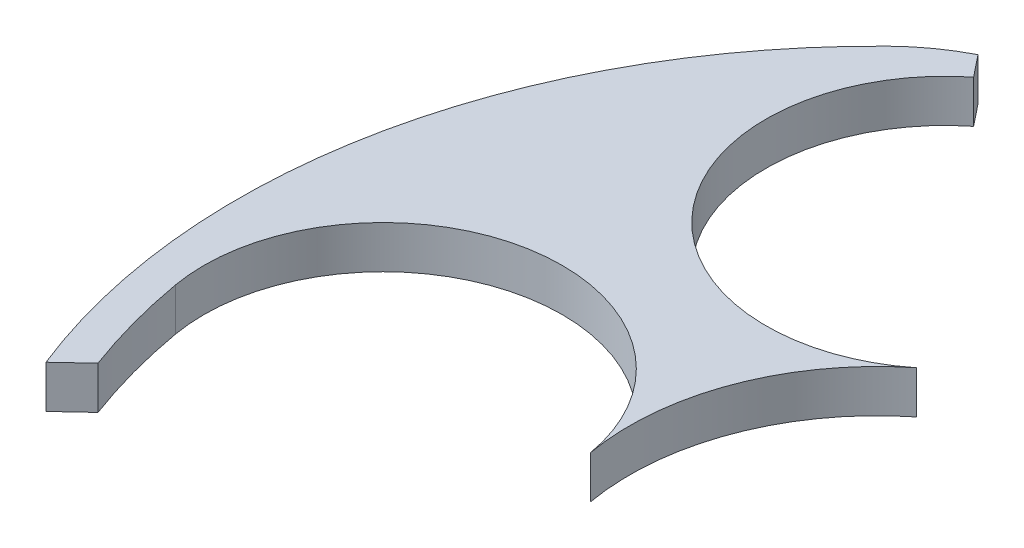
ISO-10303-21;
HEADER;
FILE_DESCRIPTION(('STEP AP214'),'2;1');
FILE_NAME('part.step','',(''),(''),'','','');
FILE_SCHEMA(('AUTOMOTIVE_DESIGN { 1 0 10303 214 1 1 1 1 }'));
ENDSEC;
DATA;
#1=APPLICATION_CONTEXT('core data for automotive mechanical design processes');
#2=APPLICATION_PROTOCOL_DEFINITION('international standard','automotive_design',2000,#1);
#3=PRODUCT_CONTEXT('',#1,'mechanical');
#4=PRODUCT('Part','Part','',(#3));
#5=PRODUCT_RELATED_PRODUCT_CATEGORY('part','',(#4));
#6=PRODUCT_DEFINITION_FORMATION('','',#4);
#7=PRODUCT_DEFINITION_CONTEXT('part definition',#1,'design');
#8=PRODUCT_DEFINITION('design','',#6,#7);
#9=PRODUCT_DEFINITION_SHAPE('','',#8);
#10=(LENGTH_UNIT() NAMED_UNIT(*) SI_UNIT(.MILLI.,.METRE.));
#11=(NAMED_UNIT(*) PLANE_ANGLE_UNIT() SI_UNIT($,.RADIAN.));
#12=(NAMED_UNIT(*) SI_UNIT($,.STERADIAN.) SOLID_ANGLE_UNIT());
#13=UNCERTAINTY_MEASURE_WITH_UNIT(LENGTH_MEASURE(1.E-05),#10,'distance_accuracy_value','');
#14=(GEOMETRIC_REPRESENTATION_CONTEXT(3) GLOBAL_UNCERTAINTY_ASSIGNED_CONTEXT((#13)) GLOBAL_UNIT_ASSIGNED_CONTEXT((#10,
#11,#12)) REPRESENTATION_CONTEXT('',''));
#15=CARTESIAN_POINT('',(0.,0.,0.));
#16=DIRECTION('',(0.,0.,1.));
#17=DIRECTION('',(1.,0.,0.));
#18=AXIS2_PLACEMENT_3D('',#15,#16,#17);
#19=CARTESIAN_POINT('',(-65.5640222322329,5.,20.1195970624359));
#20=DIRECTION('',(0.,-1.,0.));
#21=DIRECTION('',(0.,0.,-1.));
#22=AXIS2_PLACEMENT_3D('',#19,#20,#21);
#23=CYLINDRICAL_SURFACE('',#22,21.);
#24=CARTESIAN_POINT('',(-65.5640222322329,0.,20.1195970624359));
#25=DIRECTION('',(0.,1.,0.));
#26=DIRECTION('',(0.,0.,1.));
#27=AXIS2_PLACEMENT_3D('',#24,#25,#26);
#28=CIRCLE('',#27,21.);
#29=CARTESIAN_POINT('',(-44.8834254158612,0.,16.4709102687148));
#30=VERTEX_POINT('',#29);
#31=CARTESIAN_POINT('',(-86.2446190486046,0.,23.768283856157));
#32=VERTEX_POINT('',#31);
#33=EDGE_CURVE('E129',#30,#32,#28,.T.);
#34=ORIENTED_EDGE('',*,*,#33,.F.);
#35=DIRECTION('',(0.,-1.,0.));
#36=VECTOR('',#35,1.);
#37=CARTESIAN_POINT('',(-44.8834254158612,5.,16.4709102687148));
#38=LINE('',#37,#36);
#39=CARTESIAN_POINT('',(-44.8834254158612,5.,16.4709102687148));
#40=VERTEX_POINT('',#39);
#41=EDGE_CURVE('E11',#40,#30,#38,.T.);
#42=ORIENTED_EDGE('',*,*,#41,.F.);
#43=CARTESIAN_POINT('',(-65.5640222322329,5.,20.1195970624359));
#44=DIRECTION('',(0.,1.,0.));
#45=DIRECTION('',(0.,0.,1.));
#46=AXIS2_PLACEMENT_3D('',#43,#44,#45);
#47=CIRCLE('',#46,21.);
#48=CARTESIAN_POINT('',(-86.2446190486046,5.,23.768283856157));
#49=VERTEX_POINT('',#48);
#50=EDGE_CURVE('E148',#40,#49,#47,.T.);
#51=ORIENTED_EDGE('',*,*,#50,.T.);
#52=DIRECTION('',(0.,-1.,0.));
#53=VECTOR('',#52,1.);
#54=CARTESIAN_POINT('',(-86.2446190486046,5.,23.768283856157));
#55=LINE('',#54,#53);
#56=EDGE_CURVE('E51',#49,#32,#55,.T.);
#57=ORIENTED_EDGE('',*,*,#56,.T.);
#58=EDGE_LOOP('',(#34,#42,#51,#57));
#59=FACE_BOUND('',#58,.T.);
#60=ADVANCED_FACE('F35',(#59),#23,.F.);
#61=CARTESIAN_POINT('',(-16.3245060027764,5.,11.4322475535761));
#62=DIRECTION('',(0.,-1.,0.));
#63=DIRECTION('',(0.,0.,-1.));
#64=AXIS2_PLACEMENT_3D('',#61,#62,#63);
#65=CYLINDRICAL_SURFACE('',#64,29.);
#66=CARTESIAN_POINT('',(-16.3245060027764,0.,11.4322475535761));
#67=DIRECTION('',(0.,1.,0.));
#68=DIRECTION('',(0.,0.,1.));
#69=AXIS2_PLACEMENT_3D('',#66,#67,#68);
#70=CIRCLE('',#69,29.);
#71=CARTESIAN_POINT('',(-34.3894361767522,0.,-11.2538340342473));
#72=VERTEX_POINT('',#71);
#73=EDGE_CURVE('E131',#72,#30,#70,.T.);
#74=ORIENTED_EDGE('',*,*,#73,.F.);
#75=DIRECTION('',(0.,-1.,0.));
#76=VECTOR('',#75,1.);
#77=CARTESIAN_POINT('',(-34.3894361767522,5.,-11.2538340342473));
#78=LINE('',#77,#76);
#79=CARTESIAN_POINT('',(-34.3894361767522,5.,-11.2538340342473));
#80=VERTEX_POINT('',#79);
#81=EDGE_CURVE('E43',#80,#72,#78,.T.);
#82=ORIENTED_EDGE('',*,*,#81,.F.);
#83=CARTESIAN_POINT('',(-16.3245060027764,5.,11.4322475535761));
#84=DIRECTION('',(0.,1.,0.));
#85=DIRECTION('',(0.,0.,1.));
#86=AXIS2_PLACEMENT_3D('',#83,#84,#85);
#87=CIRCLE('',#86,29.);
#88=EDGE_CURVE('E174',#80,#40,#87,.T.);
#89=ORIENTED_EDGE('',*,*,#88,.T.);
#90=ORIENTED_EDGE('',*,*,#41,.T.);
#91=EDGE_LOOP('',(#74,#82,#89,#90));
#92=FACE_BOUND('',#91,.T.);
#93=ADVANCED_FACE('F165',(#92),#65,.F.);
#94=CARTESIAN_POINT('',(-47.4709373372174,5.,-27.6816862185332));
#95=DIRECTION('',(0.,-1.,0.));
#96=DIRECTION('',(0.,0.,-1.));
#97=AXIS2_PLACEMENT_3D('',#94,#95,#96);
#98=CYLINDRICAL_SURFACE('',#97,21.);
#99=CARTESIAN_POINT('',(-47.4709373372174,0.,-27.6816862185332));
#100=DIRECTION('',(0.,1.,0.));
#101=DIRECTION('',(0.,0.,1.));
#102=AXIS2_PLACEMENT_3D('',#99,#100,#101);
#103=CIRCLE('',#102,21.);
#104=CARTESIAN_POINT('',(-60.5524384976826,0.,-44.1095384028191));
#105=VERTEX_POINT('',#104);
#106=EDGE_CURVE('E134',#105,#72,#103,.T.);
#107=ORIENTED_EDGE('',*,*,#106,.F.);
#108=DIRECTION('',(0.,-1.,0.));
#109=VECTOR('',#108,1.);
#110=CARTESIAN_POINT('',(-60.5524384976826,5.,-44.1095384028191));
#111=LINE('',#110,#109);
#112=CARTESIAN_POINT('',(-60.5524384976826,5.,-44.1095384028191));
#113=VERTEX_POINT('',#112);
#114=EDGE_CURVE('E154',#113,#105,#111,.T.);
#115=ORIENTED_EDGE('',*,*,#114,.F.);
#116=CARTESIAN_POINT('',(-47.4709373372174,5.,-27.6816862185332));
#117=DIRECTION('',(0.,1.,0.));
#118=DIRECTION('',(0.,0.,1.));
#119=AXIS2_PLACEMENT_3D('',#116,#117,#118);
#120=CIRCLE('',#119,21.);
#121=EDGE_CURVE('E161',#113,#80,#120,.T.);
#122=ORIENTED_EDGE('',*,*,#121,.T.);
#123=ORIENTED_EDGE('',*,*,#81,.T.);
#124=EDGE_LOOP('',(#107,#115,#122,#123));
#125=FACE_BOUND('',#124,.T.);
#126=ADVANCED_FACE('F159',(#125),#98,.F.);
#127=CARTESIAN_POINT('',(-15.5609209442578,5.,12.3911636838887));
#128=DIRECTION('',(0.782278675442186,0.,-0.62292862668882));
#129=DIRECTION('',(-0.62292862668882,0.,-0.782278675442186));
#130=AXIS2_PLACEMENT_3D('',#127,#128,#129);
#131=PLANE('',#130);
#132=DIRECTION('',(0.62292862668882,0.,0.782278675442186));
#133=VECTOR('',#132,1.);
#134=CARTESIAN_POINT('',(-15.5609209442578,0.,12.3911636838887));
#135=LINE('',#134,#133);
#136=CARTESIAN_POINT('',(-62.5745726927873,0.,-46.6489504509076));
#137=VERTEX_POINT('',#136);
#138=EDGE_CURVE('E137',#137,#105,#135,.T.);
#139=ORIENTED_EDGE('',*,*,#138,.F.);
#140=DIRECTION('',(0.,-1.,0.));
#141=VECTOR('',#140,1.);
#142=CARTESIAN_POINT('',(-62.5745726927873,5.,-46.6489504509076));
#143=LINE('',#142,#141);
#144=CARTESIAN_POINT('',(-62.5745726927873,5.,-46.6489504509076));
#145=VERTEX_POINT('',#144);
#146=EDGE_CURVE('E152',#145,#137,#143,.T.);
#147=ORIENTED_EDGE('',*,*,#146,.F.);
#148=DIRECTION('',(0.62292862668882,0.,0.782278675442186));
#149=VECTOR('',#148,1.);
#150=CARTESIAN_POINT('',(-15.5609209442578,5.,12.3911636838887));
#151=LINE('',#150,#149);
#152=EDGE_CURVE('E173',#145,#113,#151,.T.);
#153=ORIENTED_EDGE('',*,*,#152,.T.);
#154=ORIENTED_EDGE('',*,*,#114,.T.);
#155=EDGE_LOOP('',(#139,#147,#153,#154));
#156=FACE_BOUND('',#155,.T.);
#157=ADVANCED_FACE('F171',(#156),#131,.T.);
#158=CARTESIAN_POINT('',(-51.2217062564328,5.,-24.3753691565067));
#159=DIRECTION('',(0.,-1.,0.));
#160=DIRECTION('',(0.,0.,-1.));
#161=AXIS2_PLACEMENT_3D('',#158,#159,#160);
#162=CYLINDRICAL_SURFACE('',#161,25.);
#163=CARTESIAN_POINT('',(-51.2217062564328,0.,-24.3753691565067));
#164=DIRECTION('',(0.,1.,0.));
#165=DIRECTION('',(0.,0.,1.));
#166=AXIS2_PLACEMENT_3D('',#163,#164,#165);
#167=CIRCLE('',#166,25.);
#168=CARTESIAN_POINT('',(-68.6703063832611,0.,-42.2791775115481));
#169=VERTEX_POINT('',#168);
#170=EDGE_CURVE('E140',#137,#169,#167,.T.);
#171=ORIENTED_EDGE('',*,*,#170,.T.);
#172=DIRECTION('',(0.,-1.,0.));
#173=VECTOR('',#172,1.);
#174=CARTESIAN_POINT('',(-68.6703063832611,5.,-42.2791775115481));
#175=LINE('',#174,#173);
#176=CARTESIAN_POINT('',(-68.6703063832611,5.,-42.2791775115481));
#177=VERTEX_POINT('',#176);
#178=EDGE_CURVE('E121',#177,#169,#175,.T.);
#179=ORIENTED_EDGE('',*,*,#178,.F.);
#180=CARTESIAN_POINT('',(-51.2217062564328,5.,-24.3753691565067));
#181=DIRECTION('',(0.,1.,0.));
#182=DIRECTION('',(0.,0.,1.));
#183=AXIS2_PLACEMENT_3D('',#180,#181,#182);
#184=CIRCLE('',#183,25.);
#185=EDGE_CURVE('E109',#145,#177,#184,.T.);
#186=ORIENTED_EDGE('',*,*,#185,.F.);
#187=ORIENTED_EDGE('',*,*,#146,.T.);
#188=EDGE_LOOP('',(#171,#179,#186,#187));
#189=FACE_BOUND('',#188,.T.);
#190=ADVANCED_FACE('F200',(#189),#162,.T.);
#191=CARTESIAN_POINT('',(-16.3245060027764,5.,11.4322475535761));
#192=DIRECTION('',(0.,-1.,0.));
#193=DIRECTION('',(0.,0.,-1.));
#194=AXIS2_PLACEMENT_3D('',#191,#192,#193);
#195=CYLINDRICAL_SURFACE('',#194,75.);
#196=CARTESIAN_POINT('',(-16.3245060027764,0.,11.4322475535761));
#197=DIRECTION('',(0.,1.,0.));
#198=DIRECTION('',(0.,0.,1.));
#199=AXIS2_PLACEMENT_3D('',#196,#197,#198);
#200=CIRCLE('',#199,75.);
#201=CARTESIAN_POINT('',(-85.9872504637907,0.,39.2189716166861));
#202=VERTEX_POINT('',#201);
#203=EDGE_CURVE('E118',#169,#202,#200,.T.);
#204=ORIENTED_EDGE('',*,*,#203,.T.);
#205=DIRECTION('',(0.,-1.,0.));
#206=VECTOR('',#205,1.);
#207=CARTESIAN_POINT('',(-85.9872504637907,5.,39.2189716166861));
#208=LINE('',#207,#206);
#209=CARTESIAN_POINT('',(-85.9872504637907,5.,39.2189716166861));
#210=VERTEX_POINT('',#209);
#211=EDGE_CURVE('E115',#210,#202,#208,.T.);
#212=ORIENTED_EDGE('',*,*,#211,.F.);
#213=CARTESIAN_POINT('',(-16.3245060027764,5.,11.4322475535761));
#214=DIRECTION('',(0.,1.,0.));
#215=DIRECTION('',(0.,0.,1.));
#216=AXIS2_PLACEMENT_3D('',#213,#214,#215);
#217=CIRCLE('',#216,75.);
#218=EDGE_CURVE('E101',#177,#210,#217,.T.);
#219=ORIENTED_EDGE('',*,*,#218,.F.);
#220=ORIENTED_EDGE('',*,*,#178,.T.);
#221=EDGE_LOOP('',(#204,#212,#219,#220));
#222=FACE_BOUND('',#221,.T.);
#223=ADVANCED_FACE('F116',(#222),#195,.T.);
#224=CARTESIAN_POINT('',(-20.5510824755947,5.,-21.975559807598));
#225=DIRECTION('',(-0.683038376987905,0.,-0.730382485798864));
#226=DIRECTION('',(-0.730382485798864,0.,0.683038376987905));
#227=AXIS2_PLACEMENT_3D('',#224,#225,#226);
#228=PLANE('',#227);
#229=DIRECTION('',(0.730382485798864,0.,-0.683038376987905));
#230=VECTOR('',#229,1.);
#231=CARTESIAN_POINT('',(-20.5510824755947,0.,-21.975559807598));
#232=LINE('',#231,#230);
#233=CARTESIAN_POINT('',(-82.8371613603299,0.,36.2730743773214));
#234=VERTEX_POINT('',#233);
#235=EDGE_CURVE('E143',#202,#234,#232,.T.);
#236=ORIENTED_EDGE('',*,*,#235,.T.);
#237=DIRECTION('',(0.,-1.,0.));
#238=VECTOR('',#237,1.);
#239=CARTESIAN_POINT('',(-82.8371613603299,5.,36.2730743773214));
#240=LINE('',#239,#238);
#241=CARTESIAN_POINT('',(-82.8371613603299,5.,36.2730743773214));
#242=VERTEX_POINT('',#241);
#243=EDGE_CURVE('E77',#242,#234,#240,.T.);
#244=ORIENTED_EDGE('',*,*,#243,.F.);
#245=DIRECTION('',(0.730382485798864,0.,-0.683038376987905));
#246=VECTOR('',#245,1.);
#247=CARTESIAN_POINT('',(-20.5510824755947,5.,-21.975559807598));
#248=LINE('',#247,#246);
#249=EDGE_CURVE('E106',#210,#242,#248,.T.);
#250=ORIENTED_EDGE('',*,*,#249,.F.);
#251=ORIENTED_EDGE('',*,*,#211,.T.);
#252=EDGE_LOOP('',(#236,#244,#250,#251));
#253=FACE_BOUND('',#252,.T.);
#254=ADVANCED_FACE('F123',(#253),#228,.F.);
#255=CARTESIAN_POINT('',(-16.3245060027764,5.,11.4322475535761));
#256=DIRECTION('',(0.,-1.,0.));
#257=DIRECTION('',(0.,0.,-1.));
#258=AXIS2_PLACEMENT_3D('',#255,#256,#257);
#259=CYLINDRICAL_SURFACE('',#258,71.);
#260=CARTESIAN_POINT('',(-16.3245060027764,0.,11.4322475535761));
#261=DIRECTION('',(0.,1.,0.));
#262=DIRECTION('',(0.,0.,1.));
#263=AXIS2_PLACEMENT_3D('',#260,#261,#262);
#264=CIRCLE('',#263,71.);
#265=EDGE_CURVE('E145',#32,#234,#264,.T.);
#266=ORIENTED_EDGE('',*,*,#265,.F.);
#267=ORIENTED_EDGE('',*,*,#56,.F.);
#268=CARTESIAN_POINT('',(-16.3245060027764,5.,11.4322475535761));
#269=DIRECTION('',(0.,1.,0.));
#270=DIRECTION('',(0.,0.,1.));
#271=AXIS2_PLACEMENT_3D('',#268,#269,#270);
#272=CIRCLE('',#271,71.);
#273=EDGE_CURVE('E124',#49,#242,#272,.T.);
#274=ORIENTED_EDGE('',*,*,#273,.T.);
#275=ORIENTED_EDGE('',*,*,#243,.T.);
#276=EDGE_LOOP('',(#266,#267,#274,#275));
#277=FACE_BOUND('',#276,.T.);
#278=ADVANCED_FACE('F179',(#277),#259,.F.);
#279=CARTESIAN_POINT('',(0.,5.,0.));
#280=DIRECTION('',(0.,1.,0.));
#281=DIRECTION('',(0.,0.,1.));
#282=AXIS2_PLACEMENT_3D('',#279,#280,#281);
#283=PLANE('',#282);
#284=ORIENTED_EDGE('',*,*,#50,.F.);
#285=ORIENTED_EDGE('',*,*,#88,.F.);
#286=ORIENTED_EDGE('',*,*,#121,.F.);
#287=ORIENTED_EDGE('',*,*,#152,.F.);
#288=ORIENTED_EDGE('',*,*,#185,.T.);
#289=ORIENTED_EDGE('',*,*,#218,.T.);
#290=ORIENTED_EDGE('',*,*,#249,.T.);
#291=ORIENTED_EDGE('',*,*,#273,.F.);
#292=EDGE_LOOP('',(#284,#285,#286,#287,#288,#289,#290,#291));
#293=FACE_BOUND('',#292,.T.);
#294=ADVANCED_FACE('F103',(#293),#283,.T.);
#295=CARTESIAN_POINT('',(0.,0.,0.));
#296=DIRECTION('',(0.,1.,0.));
#297=DIRECTION('',(0.,0.,1.));
#298=AXIS2_PLACEMENT_3D('',#295,#296,#297);
#299=PLANE('',#298);
#300=ORIENTED_EDGE('',*,*,#33,.T.);
#301=ORIENTED_EDGE('',*,*,#265,.T.);
#302=ORIENTED_EDGE('',*,*,#235,.F.);
#303=ORIENTED_EDGE('',*,*,#203,.F.);
#304=ORIENTED_EDGE('',*,*,#170,.F.);
#305=ORIENTED_EDGE('',*,*,#138,.T.);
#306=ORIENTED_EDGE('',*,*,#106,.T.);
#307=ORIENTED_EDGE('',*,*,#73,.T.);
#308=EDGE_LOOP('',(#300,#301,#302,#303,#304,#305,#306,#307));
#309=FACE_BOUND('',#308,.T.);
#310=ADVANCED_FACE('F167',(#309),#299,.F.);
#311=CLOSED_SHELL('',(#60,#93,#126,#157,#190,#223,#254,#278,#294,#310));
#312=MANIFOLD_SOLID_BREP('B2',#311);
#313=ADVANCED_BREP_SHAPE_REPRESENTATION('',(#18,#312),#14);
#314=SHAPE_DEFINITION_REPRESENTATION(#9,#313);
ENDSEC;
END-ISO-10303-21;
